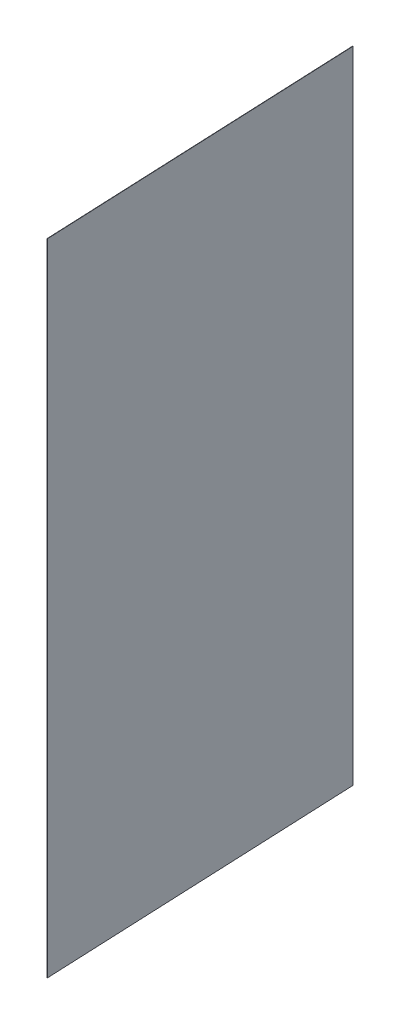
ISO-10303-21;
HEADER;
FILE_DESCRIPTION(('STEP AP214'),'2;1');
FILE_NAME('part.step','',(''),(''),'','','');
FILE_SCHEMA(('AUTOMOTIVE_DESIGN { 1 0 10303 214 1 1 1 1 }'));
ENDSEC;
DATA;
#1=APPLICATION_CONTEXT('core data for automotive mechanical design processes');
#2=APPLICATION_PROTOCOL_DEFINITION('international standard','automotive_design',2000,#1);
#3=PRODUCT_CONTEXT('',#1,'mechanical');
#4=PRODUCT('Part','Part','',(#3));
#5=PRODUCT_RELATED_PRODUCT_CATEGORY('part','',(#4));
#6=PRODUCT_DEFINITION_FORMATION('','',#4);
#7=PRODUCT_DEFINITION_CONTEXT('part definition',#1,'design');
#8=PRODUCT_DEFINITION('design','',#6,#7);
#9=PRODUCT_DEFINITION_SHAPE('','',#8);
#10=(LENGTH_UNIT() NAMED_UNIT(*) SI_UNIT(.MILLI.,.METRE.));
#11=(NAMED_UNIT(*) PLANE_ANGLE_UNIT() SI_UNIT($,.RADIAN.));
#12=(NAMED_UNIT(*) SI_UNIT($,.STERADIAN.) SOLID_ANGLE_UNIT());
#13=UNCERTAINTY_MEASURE_WITH_UNIT(LENGTH_MEASURE(1.E-05),#10,'distance_accuracy_value','');
#14=(GEOMETRIC_REPRESENTATION_CONTEXT(3) GLOBAL_UNCERTAINTY_ASSIGNED_CONTEXT((#13)) GLOBAL_UNIT_ASSIGNED_CONTEXT((#10,
#11,#12)) REPRESENTATION_CONTEXT('',''));
#15=CARTESIAN_POINT('',(0.,0.,0.));
#16=DIRECTION('',(0.,0.,1.));
#17=DIRECTION('',(1.,0.,0.));
#18=AXIS2_PLACEMENT_3D('',#15,#16,#17);
#19=CARTESIAN_POINT('',(0.948420111162285,50.8000000070577,41.8959473577808));
#20=DIRECTION('',(-0.999048221598574,0.,0.0436193869824734));
#21=DIRECTION('',(0.,1.,0.));
#22=AXIS2_PLACEMENT_3D('',#19,#20,#21);
#23=PLANE('',#22);
#24=DIRECTION('',(-0.0436193869824734,0.,-0.999048221598574));
#25=VECTOR('',#24,1.);
#26=CARTESIAN_POINT('',(0.394453896484878,25.4000000070577,29.2080349434789));
#27=LINE('',#26,#25);
#28=CARTESIAN_POINT('',(1.5023863258397,25.4000000070577,54.5838597720827));
#29=VERTEX_POINT('',#28);
#30=CARTESIAN_POINT('',(0.394453896484878,25.4000000070577,29.2080349434789));
#31=VERTEX_POINT('',#30);
#32=EDGE_CURVE('E78',#29,#31,#27,.T.);
#33=ORIENTED_EDGE('',*,*,#32,.F.);
#34=DIRECTION('',(0.,-1.,0.));
#35=VECTOR('',#34,1.);
#36=CARTESIAN_POINT('',(1.5023863258397,25.4000000070577,54.5838597720827));
#37=LINE('',#36,#35);
#38=CARTESIAN_POINT('',(1.50238632583969,76.2000000070577,54.5838597720827));
#39=VERTEX_POINT('',#38);
#40=EDGE_CURVE('E28',#39,#29,#37,.T.);
#41=ORIENTED_EDGE('',*,*,#40,.F.);
#42=DIRECTION('',(0.0436193869824734,0.,0.999048221598574));
#43=VECTOR('',#42,1.);
#44=CARTESIAN_POINT('',(0.394453896484867,76.2000000070577,29.2080349434789));
#45=LINE('',#44,#43);
#46=CARTESIAN_POINT('',(0.394453896484867,76.2000000070577,29.2080349434789));
#47=VERTEX_POINT('',#46);
#48=EDGE_CURVE('E89',#47,#39,#45,.T.);
#49=ORIENTED_EDGE('',*,*,#48,.F.);
#50=DIRECTION('',(0.,1.,0.));
#51=VECTOR('',#50,1.);
#52=CARTESIAN_POINT('',(0.394453896484878,25.4000000070577,29.2080349434789));
#53=LINE('',#52,#51);
#54=EDGE_CURVE('E55',#31,#47,#53,.T.);
#55=ORIENTED_EDGE('',*,*,#54,.F.);
#56=EDGE_LOOP('',(#33,#41,#49,#55));
#57=FACE_BOUND('',#56,.T.);
#58=ADVANCED_FACE('F17',(#57),#23,.T.);
#59=CARTESIAN_POINT('',(0.973795935990889,50.8000000070577,41.8948394253514));
#60=DIRECTION('',(-0.999048221598574,0.,0.0436193869824734));
#61=DIRECTION('',(0.,1.,0.));
#62=AXIS2_PLACEMENT_3D('',#59,#60,#61);
#63=PLANE('',#62);
#64=DIRECTION('',(-0.0436193869824734,0.,-0.999048221598574));
#65=VECTOR('',#64,1.);
#66=CARTESIAN_POINT('',(0.419829721313482,25.4000000070577,29.2069270110495));
#67=LINE('',#66,#65);
#68=CARTESIAN_POINT('',(1.52776215066831,25.4000000070577,54.5827518396533));
#69=VERTEX_POINT('',#68);
#70=CARTESIAN_POINT('',(0.419829721313482,25.4000000070577,29.2069270110495));
#71=VERTEX_POINT('',#70);
#72=EDGE_CURVE('E80',#69,#71,#67,.T.);
#73=ORIENTED_EDGE('',*,*,#72,.T.);
#74=DIRECTION('',(0.,1.,0.));
#75=VECTOR('',#74,1.);
#76=CARTESIAN_POINT('',(0.419829721313482,25.4000000070577,29.2069270110495));
#77=LINE('',#76,#75);
#78=CARTESIAN_POINT('',(0.419829721313471,76.2000000070577,29.2069270110495));
#79=VERTEX_POINT('',#78);
#80=EDGE_CURVE('E91',#71,#79,#77,.T.);
#81=ORIENTED_EDGE('',*,*,#80,.T.);
#82=DIRECTION('',(0.0436193869824734,0.,0.999048221598574));
#83=VECTOR('',#82,1.);
#84=CARTESIAN_POINT('',(0.419829721313471,76.2000000070577,29.2069270110495));
#85=LINE('',#84,#83);
#86=CARTESIAN_POINT('',(1.5277621506683,76.2000000070577,54.5827518396533));
#87=VERTEX_POINT('',#86);
#88=EDGE_CURVE('E72',#79,#87,#85,.T.);
#89=ORIENTED_EDGE('',*,*,#88,.T.);
#90=DIRECTION('',(0.,-1.,0.));
#91=VECTOR('',#90,1.);
#92=CARTESIAN_POINT('',(1.52776215066831,25.4000000070577,54.5827518396533));
#93=LINE('',#92,#91);
#94=EDGE_CURVE('E11',#87,#69,#93,.T.);
#95=ORIENTED_EDGE('',*,*,#94,.T.);
#96=EDGE_LOOP('',(#73,#81,#89,#95));
#97=FACE_BOUND('',#96,.T.);
#98=ADVANCED_FACE('F115',(#97),#63,.F.);
#99=CARTESIAN_POINT('',(1.52776215066831,25.4000000070577,54.5827518396533));
#100=DIRECTION('',(-0.0436193869824734,0.,-0.999048221598574));
#101=DIRECTION('',(-0.999048221598574,0.,0.0436193869824734));
#102=AXIS2_PLACEMENT_3D('',#99,#100,#101);
#103=PLANE('',#102);
#104=ORIENTED_EDGE('',*,*,#40,.T.);
#105=DIRECTION('',(-0.999048221598574,0.,0.0436193869824734));
#106=VECTOR('',#105,1.);
#107=CARTESIAN_POINT('',(1.52776215066831,25.4000000070577,54.5827518396533));
#108=LINE('',#107,#106);
#109=EDGE_CURVE('E66',#69,#29,#108,.T.);
#110=ORIENTED_EDGE('',*,*,#109,.F.);
#111=ORIENTED_EDGE('',*,*,#94,.F.);
#112=DIRECTION('',(-0.999048221598574,0.,0.0436193869824734));
#113=VECTOR('',#112,1.);
#114=CARTESIAN_POINT('',(1.5277621506683,76.2000000070577,54.5827518396533));
#115=LINE('',#114,#113);
#116=EDGE_CURVE('E69',#87,#39,#115,.T.);
#117=ORIENTED_EDGE('',*,*,#116,.T.);
#118=EDGE_LOOP('',(#104,#110,#111,#117));
#119=FACE_BOUND('',#118,.T.);
#120=ADVANCED_FACE('F65',(#119),#103,.F.);
#121=CARTESIAN_POINT('',(0.419829721313471,76.2000000070577,29.2069270110495));
#122=DIRECTION('',(0.,-1.,0.));
#123=DIRECTION('',(0.,0.,-1.));
#124=AXIS2_PLACEMENT_3D('',#121,#122,#123);
#125=PLANE('',#124);
#126=ORIENTED_EDGE('',*,*,#48,.T.);
#127=ORIENTED_EDGE('',*,*,#116,.F.);
#128=ORIENTED_EDGE('',*,*,#88,.F.);
#129=DIRECTION('',(-0.999048221598574,0.,0.0436193869824734));
#130=VECTOR('',#129,1.);
#131=CARTESIAN_POINT('',(0.419829721313471,76.2000000070577,29.2069270110495));
#132=LINE('',#131,#130);
#133=EDGE_CURVE('E95',#79,#47,#132,.T.);
#134=ORIENTED_EDGE('',*,*,#133,.T.);
#135=EDGE_LOOP('',(#126,#127,#128,#134));
#136=FACE_BOUND('',#135,.T.);
#137=ADVANCED_FACE('F110',(#136),#125,.F.);
#138=CARTESIAN_POINT('',(0.419829721313482,25.4000000070577,29.2069270110495));
#139=DIRECTION('',(0.0436193869824734,0.,0.999048221598574));
#140=DIRECTION('',(0.,-1.,0.));
#141=AXIS2_PLACEMENT_3D('',#138,#139,#140);
#142=PLANE('',#141);
#143=ORIENTED_EDGE('',*,*,#54,.T.);
#144=ORIENTED_EDGE('',*,*,#133,.F.);
#145=ORIENTED_EDGE('',*,*,#80,.F.);
#146=DIRECTION('',(-0.999048221598574,0.,0.0436193869824734));
#147=VECTOR('',#146,1.);
#148=CARTESIAN_POINT('',(0.419829721313482,25.4000000070577,29.2069270110495));
#149=LINE('',#148,#147);
#150=EDGE_CURVE('E21',#71,#31,#149,.T.);
#151=ORIENTED_EDGE('',*,*,#150,.T.);
#152=EDGE_LOOP('',(#143,#144,#145,#151));
#153=FACE_BOUND('',#152,.T.);
#154=ADVANCED_FACE('F19',(#153),#142,.F.);
#155=CARTESIAN_POINT('',(0.419829721313482,25.4000000070577,29.2069270110495));
#156=DIRECTION('',(0.,1.,0.));
#157=DIRECTION('',(1.,0.,0.));
#158=AXIS2_PLACEMENT_3D('',#155,#156,#157);
#159=PLANE('',#158);
#160=ORIENTED_EDGE('',*,*,#32,.T.);
#161=ORIENTED_EDGE('',*,*,#150,.F.);
#162=ORIENTED_EDGE('',*,*,#72,.F.);
#163=ORIENTED_EDGE('',*,*,#109,.T.);
#164=EDGE_LOOP('',(#160,#161,#162,#163));
#165=FACE_BOUND('',#164,.T.);
#166=ADVANCED_FACE('F76',(#165),#159,.F.);
#167=CLOSED_SHELL('',(#58,#98,#120,#137,#154,#166));
#168=MANIFOLD_SOLID_BREP('B1',#167);
#169=ADVANCED_BREP_SHAPE_REPRESENTATION('',(#18,#168),#14);
#170=SHAPE_DEFINITION_REPRESENTATION(#9,#169);
ENDSEC;
END-ISO-10303-21;
